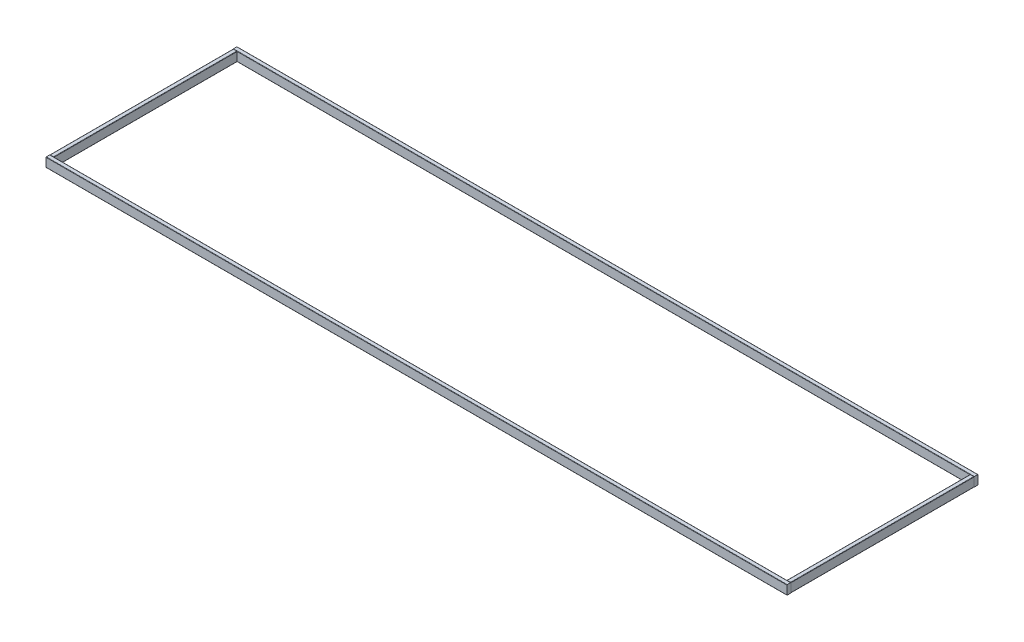
ISO-10303-21;
HEADER;
FILE_DESCRIPTION(('STEP AP214'),'2;1');
FILE_NAME('part.step','',(''),(''),'','','');
FILE_SCHEMA(('AUTOMOTIVE_DESIGN { 1 0 10303 214 1 1 1 1 }'));
ENDSEC;
DATA;
#1=APPLICATION_CONTEXT('core data for automotive mechanical design processes');
#2=APPLICATION_PROTOCOL_DEFINITION('international standard','automotive_design',2000,#1);
#3=PRODUCT_CONTEXT('',#1,'mechanical');
#4=PRODUCT('Part','Part','',(#3));
#5=PRODUCT_RELATED_PRODUCT_CATEGORY('part','',(#4));
#6=PRODUCT_DEFINITION_FORMATION('','',#4);
#7=PRODUCT_DEFINITION_CONTEXT('part definition',#1,'design');
#8=PRODUCT_DEFINITION('design','',#6,#7);
#9=PRODUCT_DEFINITION_SHAPE('','',#8);
#10=(LENGTH_UNIT() NAMED_UNIT(*) SI_UNIT(.MILLI.,.METRE.));
#11=(NAMED_UNIT(*) PLANE_ANGLE_UNIT() SI_UNIT($,.RADIAN.));
#12=(NAMED_UNIT(*) SI_UNIT($,.STERADIAN.) SOLID_ANGLE_UNIT());
#13=UNCERTAINTY_MEASURE_WITH_UNIT(LENGTH_MEASURE(1.E-05),#10,'distance_accuracy_value','');
#14=(GEOMETRIC_REPRESENTATION_CONTEXT(3) GLOBAL_UNCERTAINTY_ASSIGNED_CONTEXT((#13)) GLOBAL_UNIT_ASSIGNED_CONTEXT((#10,
#11,#12)) REPRESENTATION_CONTEXT('',''));
#15=CARTESIAN_POINT('',(0.,0.,0.));
#16=DIRECTION('',(0.,0.,1.));
#17=DIRECTION('',(1.,0.,0.));
#18=AXIS2_PLACEMENT_3D('',#15,#16,#17);
#19=CARTESIAN_POINT('',(-3556.,85.725,-892.175));
#20=DIRECTION('',(1.,0.,0.));
#21=DIRECTION('',(0.,0.,-1.));
#22=AXIS2_PLACEMENT_3D('',#19,#20,#21);
#23=CYLINDRICAL_SURFACE('',#22,3.175);
#24=CARTESIAN_POINT('',(3594.1,85.725,-892.175000000001));
#25=DIRECTION('',(1.,0.,0.));
#26=DIRECTION('',(0.,0.,-1.));
#27=AXIS2_PLACEMENT_3D('',#24,#25,#26);
#28=CIRCLE('',#27,3.175);
#29=CARTESIAN_POINT('',(3594.1,88.9,-892.175000000001));
#30=VERTEX_POINT('',#29);
#31=CARTESIAN_POINT('',(3594.1,85.725,-889.));
#32=VERTEX_POINT('',#31);
#33=EDGE_CURVE('E166',#30,#32,#28,.T.);
#34=ORIENTED_EDGE('',*,*,#33,.F.);
#35=DIRECTION('',(1.,0.,0.));
#36=VECTOR('',#35,1.);
#37=CARTESIAN_POINT('',(-3556.,88.9,-892.175));
#38=LINE('',#37,#36);
#39=CARTESIAN_POINT('',(-3594.1,88.9,-892.175));
#40=VERTEX_POINT('',#39);
#41=EDGE_CURVE('E208',#40,#30,#38,.T.);
#42=ORIENTED_EDGE('',*,*,#41,.F.);
#43=CARTESIAN_POINT('',(-3594.1,85.725,-892.175));
#44=DIRECTION('',(-1.,0.,0.));
#45=DIRECTION('',(0.,0.,1.));
#46=AXIS2_PLACEMENT_3D('',#43,#44,#45);
#47=CIRCLE('',#46,3.175);
#48=CARTESIAN_POINT('',(-3594.1,85.725,-889.));
#49=VERTEX_POINT('',#48);
#50=EDGE_CURVE('E154',#49,#40,#47,.T.);
#51=ORIENTED_EDGE('',*,*,#50,.F.);
#52=DIRECTION('',(1.,0.,0.));
#53=VECTOR('',#52,1.);
#54=CARTESIAN_POINT('',(-3556.,85.725,-889.));
#55=LINE('',#54,#53);
#56=EDGE_CURVE('E90',#49,#32,#55,.T.);
#57=ORIENTED_EDGE('',*,*,#56,.T.);
#58=EDGE_LOOP('',(#34,#42,#51,#57));
#59=FACE_BOUND('',#58,.T.);
#60=ADVANCED_FACE('F86',(#59),#23,.T.);
#61=CARTESIAN_POINT('',(-3556.,88.9,-892.175));
#62=DIRECTION('',(0.,-1.,0.));
#63=DIRECTION('',(0.,0.,-1.));
#64=AXIS2_PLACEMENT_3D('',#61,#62,#63);
#65=PLANE('',#64);
#66=DIRECTION('',(0.,0.,1.));
#67=VECTOR('',#66,1.);
#68=CARTESIAN_POINT('',(3594.1,88.9,-892.175));
#69=LINE('',#68,#67);
#70=CARTESIAN_POINT('',(3594.1,88.9,-923.925));
#71=VERTEX_POINT('',#70);
#72=EDGE_CURVE('E161',#71,#30,#69,.T.);
#73=ORIENTED_EDGE('',*,*,#72,.F.);
#74=DIRECTION('',(1.,0.,0.));
#75=VECTOR('',#74,1.);
#76=CARTESIAN_POINT('',(-3556.,88.9,-923.924999999999));
#77=LINE('',#76,#75);
#78=CARTESIAN_POINT('',(-3594.1,88.9,-923.924999999999));
#79=VERTEX_POINT('',#78);
#80=EDGE_CURVE('E205',#79,#71,#77,.T.);
#81=ORIENTED_EDGE('',*,*,#80,.F.);
#82=DIRECTION('',(0.,0.,-1.));
#83=VECTOR('',#82,1.);
#84=CARTESIAN_POINT('',(-3594.1,88.9,-892.175));
#85=LINE('',#84,#83);
#86=EDGE_CURVE('E235',#40,#79,#85,.T.);
#87=ORIENTED_EDGE('',*,*,#86,.F.);
#88=ORIENTED_EDGE('',*,*,#41,.T.);
#89=EDGE_LOOP('',(#73,#81,#87,#88));
#90=FACE_BOUND('',#89,.T.);
#91=ADVANCED_FACE('F224',(#90),#65,.F.);
#92=CARTESIAN_POINT('',(-3556.,85.725,-923.924999999999));
#93=DIRECTION('',(1.,0.,0.));
#94=DIRECTION('',(0.,0.,-1.));
#95=AXIS2_PLACEMENT_3D('',#92,#93,#94);
#96=CYLINDRICAL_SURFACE('',#95,3.175);
#97=CARTESIAN_POINT('',(3594.1,85.725,-923.925));
#98=DIRECTION('',(1.,0.,0.));
#99=DIRECTION('',(0.,0.,-1.));
#100=AXIS2_PLACEMENT_3D('',#97,#98,#99);
#101=CIRCLE('',#100,3.175);
#102=CARTESIAN_POINT('',(3594.1,85.725,-927.1));
#103=VERTEX_POINT('',#102);
#104=EDGE_CURVE('E13',#103,#71,#101,.T.);
#105=ORIENTED_EDGE('',*,*,#104,.F.);
#106=DIRECTION('',(1.,0.,0.));
#107=VECTOR('',#106,1.);
#108=CARTESIAN_POINT('',(-3556.,85.725,-927.1));
#109=LINE('',#108,#107);
#110=CARTESIAN_POINT('',(-3594.1,85.725,-927.1));
#111=VERTEX_POINT('',#110);
#112=EDGE_CURVE('E201',#111,#103,#109,.T.);
#113=ORIENTED_EDGE('',*,*,#112,.F.);
#114=CARTESIAN_POINT('',(-3594.1,85.725,-923.924999999999));
#115=DIRECTION('',(-1.,0.,0.));
#116=DIRECTION('',(0.,0.,1.));
#117=AXIS2_PLACEMENT_3D('',#114,#115,#116);
#118=CIRCLE('',#117,3.175);
#119=EDGE_CURVE('E231',#79,#111,#118,.T.);
#120=ORIENTED_EDGE('',*,*,#119,.F.);
#121=ORIENTED_EDGE('',*,*,#80,.T.);
#122=EDGE_LOOP('',(#105,#113,#120,#121));
#123=FACE_BOUND('',#122,.T.);
#124=ADVANCED_FACE('F228',(#123),#96,.T.);
#125=CARTESIAN_POINT('',(-3556.,3.175,-927.1));
#126=DIRECTION('',(0.,0.,1.));
#127=DIRECTION('',(1.,0.,0.));
#128=AXIS2_PLACEMENT_3D('',#125,#126,#127);
#129=PLANE('',#128);
#130=DIRECTION('',(0.,1.,0.));
#131=VECTOR('',#130,1.);
#132=CARTESIAN_POINT('',(3594.1,3.175,-927.1));
#133=LINE('',#132,#131);
#134=CARTESIAN_POINT('',(3594.1,3.175,-927.1));
#135=VERTEX_POINT('',#134);
#136=EDGE_CURVE('E96',#135,#103,#133,.T.);
#137=ORIENTED_EDGE('',*,*,#136,.F.);
#138=DIRECTION('',(1.,0.,0.));
#139=VECTOR('',#138,1.);
#140=CARTESIAN_POINT('',(-3556.,3.175,-927.1));
#141=LINE('',#140,#139);
#142=CARTESIAN_POINT('',(-3594.1,3.175,-927.1));
#143=VERTEX_POINT('',#142);
#144=EDGE_CURVE('E197',#143,#135,#141,.T.);
#145=ORIENTED_EDGE('',*,*,#144,.F.);
#146=DIRECTION('',(0.,-1.,0.));
#147=VECTOR('',#146,1.);
#148=CARTESIAN_POINT('',(-3594.1,3.175,-927.1));
#149=LINE('',#148,#147);
#150=EDGE_CURVE('E234',#111,#143,#149,.T.);
#151=ORIENTED_EDGE('',*,*,#150,.F.);
#152=ORIENTED_EDGE('',*,*,#112,.T.);
#153=EDGE_LOOP('',(#137,#145,#151,#152));
#154=FACE_BOUND('',#153,.T.);
#155=ADVANCED_FACE('F250',(#154),#129,.F.);
#156=CARTESIAN_POINT('',(-3556.,3.175,-923.924999999999));
#157=DIRECTION('',(1.,0.,0.));
#158=DIRECTION('',(0.,0.,-1.));
#159=AXIS2_PLACEMENT_3D('',#156,#157,#158);
#160=CYLINDRICAL_SURFACE('',#159,3.175);
#161=CARTESIAN_POINT('',(3594.1,3.175,-923.925));
#162=DIRECTION('',(1.,0.,0.));
#163=DIRECTION('',(0.,0.,-1.));
#164=AXIS2_PLACEMENT_3D('',#161,#162,#163);
#165=CIRCLE('',#164,3.175);
#166=CARTESIAN_POINT('',(3594.1,0.,-923.925));
#167=VERTEX_POINT('',#166);
#168=EDGE_CURVE('E179',#167,#135,#165,.T.);
#169=ORIENTED_EDGE('',*,*,#168,.F.);
#170=DIRECTION('',(1.,0.,0.));
#171=VECTOR('',#170,1.);
#172=CARTESIAN_POINT('',(-3556.,0.,-923.924999999999));
#173=LINE('',#172,#171);
#174=CARTESIAN_POINT('',(-3594.1,0.,-923.924999999999));
#175=VERTEX_POINT('',#174);
#176=EDGE_CURVE('E193',#175,#167,#173,.T.);
#177=ORIENTED_EDGE('',*,*,#176,.F.);
#178=CARTESIAN_POINT('',(-3594.1,3.175,-923.924999999999));
#179=DIRECTION('',(-1.,0.,0.));
#180=DIRECTION('',(0.,0.,1.));
#181=AXIS2_PLACEMENT_3D('',#178,#179,#180);
#182=CIRCLE('',#181,3.175);
#183=EDGE_CURVE('E168',#143,#175,#182,.T.);
#184=ORIENTED_EDGE('',*,*,#183,.F.);
#185=ORIENTED_EDGE('',*,*,#144,.T.);
#186=EDGE_LOOP('',(#169,#177,#184,#185));
#187=FACE_BOUND('',#186,.T.);
#188=ADVANCED_FACE('F247',(#187),#160,.T.);
#189=CARTESIAN_POINT('',(-3556.,0.,-923.924999999999));
#190=DIRECTION('',(0.,1.,0.));
#191=DIRECTION('',(0.,0.,1.));
#192=AXIS2_PLACEMENT_3D('',#189,#190,#191);
#193=PLANE('',#192);
#194=DIRECTION('',(0.,0.,-1.));
#195=VECTOR('',#194,1.);
#196=CARTESIAN_POINT('',(3594.1,0.,-923.924999999999));
#197=LINE('',#196,#195);
#198=CARTESIAN_POINT('',(3594.1,0.,-892.175000000001));
#199=VERTEX_POINT('',#198);
#200=EDGE_CURVE('E183',#199,#167,#197,.T.);
#201=ORIENTED_EDGE('',*,*,#200,.F.);
#202=DIRECTION('',(1.,0.,0.));
#203=VECTOR('',#202,1.);
#204=CARTESIAN_POINT('',(-3556.,0.,-892.175));
#205=LINE('',#204,#203);
#206=CARTESIAN_POINT('',(-3594.1,0.,-892.175));
#207=VERTEX_POINT('',#206);
#208=EDGE_CURVE('E147',#207,#199,#205,.T.);
#209=ORIENTED_EDGE('',*,*,#208,.F.);
#210=DIRECTION('',(0.,0.,1.));
#211=VECTOR('',#210,1.);
#212=CARTESIAN_POINT('',(-3594.1,0.,-923.924999999999));
#213=LINE('',#212,#211);
#214=EDGE_CURVE('E159',#175,#207,#213,.T.);
#215=ORIENTED_EDGE('',*,*,#214,.F.);
#216=ORIENTED_EDGE('',*,*,#176,.T.);
#217=EDGE_LOOP('',(#201,#209,#215,#216));
#218=FACE_BOUND('',#217,.T.);
#219=ADVANCED_FACE('F255',(#218),#193,.F.);
#220=CARTESIAN_POINT('',(-3556.,3.175,-892.175));
#221=DIRECTION('',(1.,0.,0.));
#222=DIRECTION('',(0.,0.,-1.));
#223=AXIS2_PLACEMENT_3D('',#220,#221,#222);
#224=CYLINDRICAL_SURFACE('',#223,3.175);
#225=CARTESIAN_POINT('',(3594.1,3.175,-892.175000000001));
#226=DIRECTION('',(1.,0.,0.));
#227=DIRECTION('',(0.,0.,-1.));
#228=AXIS2_PLACEMENT_3D('',#225,#226,#227);
#229=CIRCLE('',#228,3.175);
#230=CARTESIAN_POINT('',(3594.1,3.175,-889.));
#231=VERTEX_POINT('',#230);
#232=EDGE_CURVE('E143',#231,#199,#229,.T.);
#233=ORIENTED_EDGE('',*,*,#232,.F.);
#234=DIRECTION('',(1.,0.,0.));
#235=VECTOR('',#234,1.);
#236=CARTESIAN_POINT('',(-3556.,3.175,-889.));
#237=LINE('',#236,#235);
#238=CARTESIAN_POINT('',(-3594.1,3.175,-889.));
#239=VERTEX_POINT('',#238);
#240=EDGE_CURVE('E104',#239,#231,#237,.T.);
#241=ORIENTED_EDGE('',*,*,#240,.F.);
#242=CARTESIAN_POINT('',(-3594.1,3.175,-892.175));
#243=DIRECTION('',(-1.,0.,0.));
#244=DIRECTION('',(0.,0.,1.));
#245=AXIS2_PLACEMENT_3D('',#242,#243,#244);
#246=CIRCLE('',#245,3.175);
#247=EDGE_CURVE('E140',#207,#239,#246,.T.);
#248=ORIENTED_EDGE('',*,*,#247,.F.);
#249=ORIENTED_EDGE('',*,*,#208,.T.);
#250=EDGE_LOOP('',(#233,#241,#248,#249));
#251=FACE_BOUND('',#250,.T.);
#252=ADVANCED_FACE('F137',(#251),#224,.T.);
#253=CARTESIAN_POINT('',(-3556.,85.725,-889.));
#254=DIRECTION('',(0.,0.,-1.));
#255=DIRECTION('',(-1.,0.,0.));
#256=AXIS2_PLACEMENT_3D('',#253,#254,#255);
#257=PLANE('',#256);
#258=DIRECTION('',(0.,-1.,0.));
#259=VECTOR('',#258,1.);
#260=CARTESIAN_POINT('',(3594.1,85.725,-889.));
#261=LINE('',#260,#259);
#262=EDGE_CURVE('E174',#32,#231,#261,.T.);
#263=ORIENTED_EDGE('',*,*,#262,.F.);
#264=ORIENTED_EDGE('',*,*,#56,.F.);
#265=DIRECTION('',(0.,1.,0.));
#266=VECTOR('',#265,1.);
#267=CARTESIAN_POINT('',(-3594.1,85.725,-889.));
#268=LINE('',#267,#266);
#269=EDGE_CURVE('E146',#239,#49,#268,.T.);
#270=ORIENTED_EDGE('',*,*,#269,.F.);
#271=ORIENTED_EDGE('',*,*,#240,.T.);
#272=EDGE_LOOP('',(#263,#264,#270,#271));
#273=FACE_BOUND('',#272,.T.);
#274=ADVANCED_FACE('F150',(#273),#257,.F.);
#275=CARTESIAN_POINT('',(-3594.1,88.9,-888.999999999999));
#276=DIRECTION('',(-1.,0.,0.));
#277=DIRECTION('',(0.,0.,1.));
#278=AXIS2_PLACEMENT_3D('',#275,#276,#277);
#279=PLANE('',#278);
#280=ORIENTED_EDGE('',*,*,#269,.T.);
#281=ORIENTED_EDGE('',*,*,#50,.T.);
#282=ORIENTED_EDGE('',*,*,#86,.T.);
#283=ORIENTED_EDGE('',*,*,#119,.T.);
#284=ORIENTED_EDGE('',*,*,#150,.T.);
#285=ORIENTED_EDGE('',*,*,#183,.T.);
#286=ORIENTED_EDGE('',*,*,#214,.T.);
#287=ORIENTED_EDGE('',*,*,#247,.T.);
#288=EDGE_LOOP('',(#280,#281,#282,#283,#284,#285,#286,#287));
#289=FACE_BOUND('',#288,.T.);
#290=ADVANCED_FACE('F157',(#289),#279,.T.);
#291=CARTESIAN_POINT('',(3594.1,0.,-889.));
#292=DIRECTION('',(1.,0.,0.));
#293=DIRECTION('',(0.,0.,-1.));
#294=AXIS2_PLACEMENT_3D('',#291,#292,#293);
#295=PLANE('',#294);
#296=ORIENTED_EDGE('',*,*,#72,.T.);
#297=ORIENTED_EDGE('',*,*,#33,.T.);
#298=ORIENTED_EDGE('',*,*,#262,.T.);
#299=ORIENTED_EDGE('',*,*,#232,.T.);
#300=ORIENTED_EDGE('',*,*,#200,.T.);
#301=ORIENTED_EDGE('',*,*,#168,.T.);
#302=ORIENTED_EDGE('',*,*,#136,.T.);
#303=ORIENTED_EDGE('',*,*,#104,.T.);
#304=EDGE_LOOP('',(#296,#297,#298,#299,#300,#301,#302,#303));
#305=FACE_BOUND('',#304,.T.);
#306=ADVANCED_FACE('F88',(#305),#295,.T.);
#307=CLOSED_SHELL('',(#60,#91,#124,#155,#188,#219,#252,#274,#290,#306));
#308=MANIFOLD_SOLID_BREP('B2',#307);
#309=CARTESIAN_POINT('',(3556.,85.725,-889.));
#310=DIRECTION('',(1.,0.,0.));
#311=DIRECTION('',(0.,0.,-1.));
#312=AXIS2_PLACEMENT_3D('',#309,#310,#311);
#313=PLANE('',#312);
#314=DIRECTION('',(0.,1.,0.));
#315=VECTOR('',#314,1.);
#316=CARTESIAN_POINT('',(3556.,85.725,-889.));
#317=LINE('',#316,#315);
#318=CARTESIAN_POINT('',(3556.,3.175,-889.));
#319=VERTEX_POINT('',#318);
#320=CARTESIAN_POINT('',(3556.,85.725,-889.));
#321=VERTEX_POINT('',#320);
#322=EDGE_CURVE('E436',#319,#321,#317,.T.);
#323=ORIENTED_EDGE('',*,*,#322,.F.);
#324=DIRECTION('',(0.,0.,1.));
#325=VECTOR('',#324,1.);
#326=CARTESIAN_POINT('',(3556.,3.175,-889.));
#327=LINE('',#326,#325);
#328=CARTESIAN_POINT('',(3556.,3.175,889.));
#329=VERTEX_POINT('',#328);
#330=EDGE_CURVE('E516',#319,#329,#327,.T.);
#331=ORIENTED_EDGE('',*,*,#330,.T.);
#332=DIRECTION('',(0.,-1.,0.));
#333=VECTOR('',#332,1.);
#334=CARTESIAN_POINT('',(3556.,85.725,889.));
#335=LINE('',#334,#333);
#336=CARTESIAN_POINT('',(3556.,85.725,889.));
#337=VERTEX_POINT('',#336);
#338=EDGE_CURVE('E483',#337,#329,#335,.T.);
#339=ORIENTED_EDGE('',*,*,#338,.F.);
#340=DIRECTION('',(0.,0.,1.));
#341=VECTOR('',#340,1.);
#342=CARTESIAN_POINT('',(3556.,85.725,-889.));
#343=LINE('',#342,#341);
#344=EDGE_CURVE('E396',#321,#337,#343,.T.);
#345=ORIENTED_EDGE('',*,*,#344,.F.);
#346=EDGE_LOOP('',(#323,#331,#339,#345));
#347=FACE_BOUND('',#346,.T.);
#348=ADVANCED_FACE('F393',(#347),#313,.F.);
#349=CARTESIAN_POINT('',(3559.175,3.175,-889.));
#350=DIRECTION('',(0.,0.,1.));
#351=DIRECTION('',(1.,0.,0.));
#352=AXIS2_PLACEMENT_3D('',#349,#350,#351);
#353=CYLINDRICAL_SURFACE('',#352,3.175);
#354=CARTESIAN_POINT('',(3559.175,3.175,-889.));
#355=DIRECTION('',(0.,0.,-1.));
#356=DIRECTION('',(-1.,0.,0.));
#357=AXIS2_PLACEMENT_3D('',#354,#355,#356);
#358=CIRCLE('',#357,3.175);
#359=CARTESIAN_POINT('',(3559.175,0.,-889.));
#360=VERTEX_POINT('',#359);
#361=EDGE_CURVE('E498',#360,#319,#358,.T.);
#362=ORIENTED_EDGE('',*,*,#361,.F.);
#363=DIRECTION('',(0.,0.,1.));
#364=VECTOR('',#363,1.);
#365=CARTESIAN_POINT('',(3559.175,0.,-889.));
#366=LINE('',#365,#364);
#367=CARTESIAN_POINT('',(3559.175,0.,889.));
#368=VERTEX_POINT('',#367);
#369=EDGE_CURVE('E508',#360,#368,#366,.T.);
#370=ORIENTED_EDGE('',*,*,#369,.T.);
#371=CARTESIAN_POINT('',(3559.175,3.175,889.));
#372=DIRECTION('',(0.,0.,1.));
#373=DIRECTION('',(1.,0.,0.));
#374=AXIS2_PLACEMENT_3D('',#371,#372,#373);
#375=CIRCLE('',#374,3.175);
#376=EDGE_CURVE('E485',#329,#368,#375,.T.);
#377=ORIENTED_EDGE('',*,*,#376,.F.);
#378=ORIENTED_EDGE('',*,*,#330,.F.);
#379=EDGE_LOOP('',(#362,#370,#377,#378));
#380=FACE_BOUND('',#379,.T.);
#381=ADVANCED_FACE('F523',(#380),#353,.T.);
#382=CARTESIAN_POINT('',(3590.925,0.,-889.));
#383=DIRECTION('',(0.,1.,0.));
#384=DIRECTION('',(0.,0.,1.));
#385=AXIS2_PLACEMENT_3D('',#382,#383,#384);
#386=PLANE('',#385);
#387=DIRECTION('',(1.,0.,0.));
#388=VECTOR('',#387,1.);
#389=CARTESIAN_POINT('',(-3556.,0.,-889.));
#390=LINE('',#389,#388);
#391=CARTESIAN_POINT('',(3590.925,0.,-889.));
#392=VERTEX_POINT('',#391);
#393=EDGE_CURVE('E504',#360,#392,#390,.T.);
#394=ORIENTED_EDGE('',*,*,#393,.T.);
#395=DIRECTION('',(0.,0.,1.));
#396=VECTOR('',#395,1.);
#397=CARTESIAN_POINT('',(3590.925,0.,-889.));
#398=LINE('',#397,#396);
#399=CARTESIAN_POINT('',(3590.925,0.,889.));
#400=VERTEX_POINT('',#399);
#401=EDGE_CURVE('E507',#392,#400,#398,.T.);
#402=ORIENTED_EDGE('',*,*,#401,.T.);
#403=DIRECTION('',(1.,0.,0.));
#404=VECTOR('',#403,1.);
#405=CARTESIAN_POINT('',(-3556.,0.,889.));
#406=LINE('',#405,#404);
#407=EDGE_CURVE('E493',#368,#400,#406,.T.);
#408=ORIENTED_EDGE('',*,*,#407,.F.);
#409=ORIENTED_EDGE('',*,*,#369,.F.);
#410=EDGE_LOOP('',(#394,#402,#408,#409));
#411=FACE_BOUND('',#410,.T.);
#412=ADVANCED_FACE('F526',(#411),#386,.F.);
#413=CARTESIAN_POINT('',(3590.925,3.175,-889.));
#414=DIRECTION('',(0.,0.,1.));
#415=DIRECTION('',(1.,0.,0.));
#416=AXIS2_PLACEMENT_3D('',#413,#414,#415);
#417=CYLINDRICAL_SURFACE('',#416,3.175);
#418=CARTESIAN_POINT('',(3590.925,3.175,-889.));
#419=DIRECTION('',(0.,0.,-1.));
#420=DIRECTION('',(-1.,0.,0.));
#421=AXIS2_PLACEMENT_3D('',#418,#419,#420);
#422=CIRCLE('',#421,3.175);
#423=CARTESIAN_POINT('',(3594.1,3.175,-889.));
#424=VERTEX_POINT('',#423);
#425=EDGE_CURVE('E497',#424,#392,#422,.T.);
#426=ORIENTED_EDGE('',*,*,#425,.F.);
#427=DIRECTION('',(0.,0.,1.));
#428=VECTOR('',#427,1.);
#429=CARTESIAN_POINT('',(3594.1,3.175,-889.));
#430=LINE('',#429,#428);
#431=CARTESIAN_POINT('',(3594.1,3.175,889.));
#432=VERTEX_POINT('',#431);
#433=EDGE_CURVE('E513',#424,#432,#430,.T.);
#434=ORIENTED_EDGE('',*,*,#433,.T.);
#435=CARTESIAN_POINT('',(3590.925,3.175,889.));
#436=DIRECTION('',(0.,0.,1.));
#437=DIRECTION('',(1.,0.,0.));
#438=AXIS2_PLACEMENT_3D('',#435,#436,#437);
#439=CIRCLE('',#438,3.175);
#440=EDGE_CURVE('E490',#400,#432,#439,.T.);
#441=ORIENTED_EDGE('',*,*,#440,.F.);
#442=ORIENTED_EDGE('',*,*,#401,.F.);
#443=EDGE_LOOP('',(#426,#434,#441,#442));
#444=FACE_BOUND('',#443,.T.);
#445=ADVANCED_FACE('F532',(#444),#417,.T.);
#446=CARTESIAN_POINT('',(3594.1,3.175,-889.));
#447=DIRECTION('',(-1.,0.,0.));
#448=DIRECTION('',(0.,0.,1.));
#449=AXIS2_PLACEMENT_3D('',#446,#447,#448);
#450=PLANE('',#449);
#451=DIRECTION('',(0.,-1.,0.));
#452=VECTOR('',#451,1.);
#453=CARTESIAN_POINT('',(3594.1,3.175,-889.));
#454=LINE('',#453,#452);
#455=CARTESIAN_POINT('',(3594.1,85.725,-889.));
#456=VERTEX_POINT('',#455);
#457=EDGE_CURVE('E84',#456,#424,#454,.T.);
#458=ORIENTED_EDGE('',*,*,#457,.F.);
#459=DIRECTION('',(0.,0.,1.));
#460=VECTOR('',#459,1.);
#461=CARTESIAN_POINT('',(3594.1,85.725,-889.));
#462=LINE('',#461,#460);
#463=CARTESIAN_POINT('',(3594.1,85.725,889.));
#464=VERTEX_POINT('',#463);
#465=EDGE_CURVE('E511',#456,#464,#462,.T.);
#466=ORIENTED_EDGE('',*,*,#465,.T.);
#467=DIRECTION('',(0.,1.,0.));
#468=VECTOR('',#467,1.);
#469=CARTESIAN_POINT('',(3594.1,3.175,889.));
#470=LINE('',#469,#468);
#471=EDGE_CURVE('E499',#432,#464,#470,.T.);
#472=ORIENTED_EDGE('',*,*,#471,.F.);
#473=ORIENTED_EDGE('',*,*,#433,.F.);
#474=EDGE_LOOP('',(#458,#466,#472,#473));
#475=FACE_BOUND('',#474,.T.);
#476=ADVANCED_FACE('F538',(#475),#450,.F.);
#477=CARTESIAN_POINT('',(3590.925,85.725,-889.));
#478=DIRECTION('',(0.,0.,1.));
#479=DIRECTION('',(1.,0.,0.));
#480=AXIS2_PLACEMENT_3D('',#477,#478,#479);
#481=CYLINDRICAL_SURFACE('',#480,3.175);
#482=CARTESIAN_POINT('',(3590.925,85.725,-889.));
#483=DIRECTION('',(0.,0.,-1.));
#484=DIRECTION('',(-1.,0.,0.));
#485=AXIS2_PLACEMENT_3D('',#482,#483,#484);
#486=CIRCLE('',#485,3.175);
#487=CARTESIAN_POINT('',(3590.925,88.9,-889.));
#488=VERTEX_POINT('',#487);
#489=EDGE_CURVE('E402',#488,#456,#486,.T.);
#490=ORIENTED_EDGE('',*,*,#489,.F.);
#491=DIRECTION('',(0.,0.,1.));
#492=VECTOR('',#491,1.);
#493=CARTESIAN_POINT('',(3590.925,88.9,-889.));
#494=LINE('',#493,#492);
#495=CARTESIAN_POINT('',(3590.925,88.9,889.));
#496=VERTEX_POINT('',#495);
#497=EDGE_CURVE('E459',#488,#496,#494,.T.);
#498=ORIENTED_EDGE('',*,*,#497,.T.);
#499=CARTESIAN_POINT('',(3590.925,85.725,889.));
#500=DIRECTION('',(0.,0.,1.));
#501=DIRECTION('',(1.,0.,0.));
#502=AXIS2_PLACEMENT_3D('',#499,#500,#501);
#503=CIRCLE('',#502,3.175);
#504=EDGE_CURVE('E479',#464,#496,#503,.T.);
#505=ORIENTED_EDGE('',*,*,#504,.F.);
#506=ORIENTED_EDGE('',*,*,#465,.F.);
#507=EDGE_LOOP('',(#490,#498,#505,#506));
#508=FACE_BOUND('',#507,.T.);
#509=ADVANCED_FACE('F537',(#508),#481,.T.);
#510=CARTESIAN_POINT('',(3559.175,88.9,-889.));
#511=DIRECTION('',(0.,-1.,0.));
#512=DIRECTION('',(0.,0.,-1.));
#513=AXIS2_PLACEMENT_3D('',#510,#511,#512);
#514=PLANE('',#513);
#515=DIRECTION('',(1.,0.,0.));
#516=VECTOR('',#515,1.);
#517=CARTESIAN_POINT('',(-3556.,88.9,-889.));
#518=LINE('',#517,#516);
#519=CARTESIAN_POINT('',(3559.175,88.9,-889.));
#520=VERTEX_POINT('',#519);
#521=EDGE_CURVE('E429',#520,#488,#518,.T.);
#522=ORIENTED_EDGE('',*,*,#521,.F.);
#523=DIRECTION('',(0.,0.,1.));
#524=VECTOR('',#523,1.);
#525=CARTESIAN_POINT('',(3559.175,88.9,-889.));
#526=LINE('',#525,#524);
#527=CARTESIAN_POINT('',(3559.175,88.9,889.));
#528=VERTEX_POINT('',#527);
#529=EDGE_CURVE('E465',#520,#528,#526,.T.);
#530=ORIENTED_EDGE('',*,*,#529,.T.);
#531=DIRECTION('',(1.,0.,0.));
#532=VECTOR('',#531,1.);
#533=CARTESIAN_POINT('',(-3556.,88.9,889.));
#534=LINE('',#533,#532);
#535=EDGE_CURVE('E468',#528,#496,#534,.T.);
#536=ORIENTED_EDGE('',*,*,#535,.T.);
#537=ORIENTED_EDGE('',*,*,#497,.F.);
#538=EDGE_LOOP('',(#522,#530,#536,#537));
#539=FACE_BOUND('',#538,.T.);
#540=ADVANCED_FACE('F467',(#539),#514,.F.);
#541=CARTESIAN_POINT('',(3559.175,85.725,-889.));
#542=DIRECTION('',(0.,0.,1.));
#543=DIRECTION('',(1.,0.,0.));
#544=AXIS2_PLACEMENT_3D('',#541,#542,#543);
#545=CYLINDRICAL_SURFACE('',#544,3.175);
#546=CARTESIAN_POINT('',(3559.175,85.725,-889.));
#547=DIRECTION('',(0.,0.,-1.));
#548=DIRECTION('',(-1.,0.,0.));
#549=AXIS2_PLACEMENT_3D('',#546,#547,#548);
#550=CIRCLE('',#549,3.175);
#551=EDGE_CURVE('E433',#321,#520,#550,.T.);
#552=ORIENTED_EDGE('',*,*,#551,.F.);
#553=ORIENTED_EDGE('',*,*,#344,.T.);
#554=CARTESIAN_POINT('',(3559.175,85.725,889.));
#555=DIRECTION('',(0.,0.,1.));
#556=DIRECTION('',(1.,0.,0.));
#557=AXIS2_PLACEMENT_3D('',#554,#555,#556);
#558=CIRCLE('',#557,3.175);
#559=EDGE_CURVE('E476',#528,#337,#558,.T.);
#560=ORIENTED_EDGE('',*,*,#559,.F.);
#561=ORIENTED_EDGE('',*,*,#529,.F.);
#562=EDGE_LOOP('',(#552,#553,#560,#561));
#563=FACE_BOUND('',#562,.T.);
#564=ADVANCED_FACE('F481',(#563),#545,.T.);
#565=CARTESIAN_POINT('',(-3556.,3.175,889.));
#566=DIRECTION('',(0.,0.,1.));
#567=DIRECTION('',(1.,0.,0.));
#568=AXIS2_PLACEMENT_3D('',#565,#566,#567);
#569=PLANE('',#568);
#570=ORIENTED_EDGE('',*,*,#504,.T.);
#571=ORIENTED_EDGE('',*,*,#535,.F.);
#572=ORIENTED_EDGE('',*,*,#559,.T.);
#573=ORIENTED_EDGE('',*,*,#338,.T.);
#574=ORIENTED_EDGE('',*,*,#376,.T.);
#575=ORIENTED_EDGE('',*,*,#407,.T.);
#576=ORIENTED_EDGE('',*,*,#440,.T.);
#577=ORIENTED_EDGE('',*,*,#471,.T.);
#578=EDGE_LOOP('',(#570,#571,#572,#573,#574,#575,#576,#577));
#579=FACE_BOUND('',#578,.T.);
#580=ADVANCED_FACE('F474',(#579),#569,.T.);
#581=CARTESIAN_POINT('',(-3556.,85.725,-889.));
#582=DIRECTION('',(0.,0.,-1.));
#583=DIRECTION('',(-1.,0.,0.));
#584=AXIS2_PLACEMENT_3D('',#581,#582,#583);
#585=PLANE('',#584);
#586=ORIENTED_EDGE('',*,*,#425,.T.);
#587=ORIENTED_EDGE('',*,*,#393,.F.);
#588=ORIENTED_EDGE('',*,*,#361,.T.);
#589=ORIENTED_EDGE('',*,*,#322,.T.);
#590=ORIENTED_EDGE('',*,*,#551,.T.);
#591=ORIENTED_EDGE('',*,*,#521,.T.);
#592=ORIENTED_EDGE('',*,*,#489,.T.);
#593=ORIENTED_EDGE('',*,*,#457,.T.);
#594=EDGE_LOOP('',(#586,#587,#588,#589,#590,#591,#592,#593));
#595=FACE_BOUND('',#594,.T.);
#596=ADVANCED_FACE('F603',(#595),#585,.T.);
#597=CLOSED_SHELL('',(#348,#381,#412,#445,#476,#509,#540,#564,#580,#596));
#598=MANIFOLD_SOLID_BREP('B7',#597);
#599=CARTESIAN_POINT('',(-3594.1,85.725,-888.999999999999));
#600=DIRECTION('',(1.,0.,0.));
#601=DIRECTION('',(0.,0.,-1.));
#602=AXIS2_PLACEMENT_3D('',#599,#600,#601);
#603=PLANE('',#602);
#604=DIRECTION('',(0.,1.,0.));
#605=VECTOR('',#604,1.);
#606=CARTESIAN_POINT('',(-3594.1,85.725,-889.));
#607=LINE('',#606,#605);
#608=CARTESIAN_POINT('',(-3594.1,3.175,-889.));
#609=VERTEX_POINT('',#608);
#610=CARTESIAN_POINT('',(-3594.1,85.725,-889.));
#611=VERTEX_POINT('',#610);
#612=EDGE_CURVE('E718',#609,#611,#607,.T.);
#613=ORIENTED_EDGE('',*,*,#612,.F.);
#614=DIRECTION('',(0.,0.,1.));
#615=VECTOR('',#614,1.);
#616=CARTESIAN_POINT('',(-3594.1,3.175,-888.999999999999));
#617=LINE('',#616,#615);
#618=CARTESIAN_POINT('',(-3594.1,3.175,889.));
#619=VERTEX_POINT('',#618);
#620=EDGE_CURVE('E756',#609,#619,#617,.T.);
#621=ORIENTED_EDGE('',*,*,#620,.T.);
#622=DIRECTION('',(0.,-1.,0.));
#623=VECTOR('',#622,1.);
#624=CARTESIAN_POINT('',(-3594.1,85.725,889.));
#625=LINE('',#624,#623);
#626=CARTESIAN_POINT('',(-3594.1,85.725,889.));
#627=VERTEX_POINT('',#626);
#628=EDGE_CURVE('E767',#627,#619,#625,.T.);
#629=ORIENTED_EDGE('',*,*,#628,.F.);
#630=DIRECTION('',(0.,0.,1.));
#631=VECTOR('',#630,1.);
#632=CARTESIAN_POINT('',(-3594.1,85.725,-888.999999999999));
#633=LINE('',#632,#631);
#634=EDGE_CURVE('E678',#611,#627,#633,.T.);
#635=ORIENTED_EDGE('',*,*,#634,.F.);
#636=EDGE_LOOP('',(#613,#621,#629,#635));
#637=FACE_BOUND('',#636,.T.);
#638=ADVANCED_FACE('F675',(#637),#603,.F.);
#639=CARTESIAN_POINT('',(-3590.925,3.175,-888.999999999999));
#640=DIRECTION('',(0.,0.,1.));
#641=DIRECTION('',(1.,0.,0.));
#642=AXIS2_PLACEMENT_3D('',#639,#640,#641);
#643=CYLINDRICAL_SURFACE('',#642,3.175);
#644=CARTESIAN_POINT('',(-3590.925,3.175,-889.));
#645=DIRECTION('',(0.,0.,-1.));
#646=DIRECTION('',(-1.,0.,0.));
#647=AXIS2_PLACEMENT_3D('',#644,#645,#646);
#648=CIRCLE('',#647,3.175);
#649=CARTESIAN_POINT('',(-3590.925,0.,-889.));
#650=VERTEX_POINT('',#649);
#651=EDGE_CURVE('E754',#650,#609,#648,.T.);
#652=ORIENTED_EDGE('',*,*,#651,.F.);
#653=DIRECTION('',(0.,0.,1.));
#654=VECTOR('',#653,1.);
#655=CARTESIAN_POINT('',(-3590.925,0.,-888.999999999999));
#656=LINE('',#655,#654);
#657=CARTESIAN_POINT('',(-3590.925,0.,889.));
#658=VERTEX_POINT('',#657);
#659=EDGE_CURVE('E749',#650,#658,#656,.T.);
#660=ORIENTED_EDGE('',*,*,#659,.T.);
#661=CARTESIAN_POINT('',(-3590.925,3.175,889.));
#662=DIRECTION('',(0.,0.,1.));
#663=DIRECTION('',(1.,0.,0.));
#664=AXIS2_PLACEMENT_3D('',#661,#662,#663);
#665=CIRCLE('',#664,3.175);
#666=EDGE_CURVE('E753',#619,#658,#665,.T.);
#667=ORIENTED_EDGE('',*,*,#666,.F.);
#668=ORIENTED_EDGE('',*,*,#620,.F.);
#669=EDGE_LOOP('',(#652,#660,#667,#668));
#670=FACE_BOUND('',#669,.T.);
#671=ADVANCED_FACE('F751',(#670),#643,.T.);
#672=CARTESIAN_POINT('',(-3559.175,0.,-888.999999999999));
#673=DIRECTION('',(0.,1.,0.));
#674=DIRECTION('',(0.,0.,1.));
#675=AXIS2_PLACEMENT_3D('',#672,#673,#674);
#676=PLANE('',#675);
#677=DIRECTION('',(1.,0.,0.));
#678=VECTOR('',#677,1.);
#679=CARTESIAN_POINT('',(-3556.,0.,-889.));
#680=LINE('',#679,#678);
#681=CARTESIAN_POINT('',(-3559.175,0.,-889.));
#682=VERTEX_POINT('',#681);
#683=EDGE_CURVE('E755',#650,#682,#680,.T.);
#684=ORIENTED_EDGE('',*,*,#683,.T.);
#685=DIRECTION('',(0.,0.,1.));
#686=VECTOR('',#685,1.);
#687=CARTESIAN_POINT('',(-3559.175,0.,-888.999999999999));
#688=LINE('',#687,#686);
#689=CARTESIAN_POINT('',(-3559.175,0.,889.));
#690=VERTEX_POINT('',#689);
#691=EDGE_CURVE('E742',#682,#690,#688,.T.);
#692=ORIENTED_EDGE('',*,*,#691,.T.);
#693=DIRECTION('',(1.,0.,0.));
#694=VECTOR('',#693,1.);
#695=CARTESIAN_POINT('',(-3556.,0.,889.));
#696=LINE('',#695,#694);
#697=EDGE_CURVE('E763',#658,#690,#696,.T.);
#698=ORIENTED_EDGE('',*,*,#697,.F.);
#699=ORIENTED_EDGE('',*,*,#659,.F.);
#700=EDGE_LOOP('',(#684,#692,#698,#699));
#701=FACE_BOUND('',#700,.T.);
#702=ADVANCED_FACE('F769',(#701),#676,.F.);
#703=CARTESIAN_POINT('',(-3559.175,3.175,-888.999999999999));
#704=DIRECTION('',(0.,0.,1.));
#705=DIRECTION('',(1.,0.,0.));
#706=AXIS2_PLACEMENT_3D('',#703,#704,#705);
#707=CYLINDRICAL_SURFACE('',#706,3.175);
#708=CARTESIAN_POINT('',(-3559.175,3.175,-889.));
#709=DIRECTION('',(0.,0.,-1.));
#710=DIRECTION('',(-1.,0.,0.));
#711=AXIS2_PLACEMENT_3D('',#708,#709,#710);
#712=CIRCLE('',#711,3.175);
#713=CARTESIAN_POINT('',(-3556.,3.175,-889.));
#714=VERTEX_POINT('',#713);
#715=EDGE_CURVE('E777',#714,#682,#712,.T.);
#716=ORIENTED_EDGE('',*,*,#715,.F.);
#717=DIRECTION('',(0.,0.,1.));
#718=VECTOR('',#717,1.);
#719=CARTESIAN_POINT('',(-3556.,3.175,-888.999999999999));
#720=LINE('',#719,#718);
#721=CARTESIAN_POINT('',(-3556.,3.175,889.));
#722=VERTEX_POINT('',#721);
#723=EDGE_CURVE('E790',#714,#722,#720,.T.);
#724=ORIENTED_EDGE('',*,*,#723,.T.);
#725=CARTESIAN_POINT('',(-3559.175,3.175,889.));
#726=DIRECTION('',(0.,0.,1.));
#727=DIRECTION('',(1.,0.,0.));
#728=AXIS2_PLACEMENT_3D('',#725,#726,#727);
#729=CIRCLE('',#728,3.175);
#730=EDGE_CURVE('E770',#690,#722,#729,.T.);
#731=ORIENTED_EDGE('',*,*,#730,.F.);
#732=ORIENTED_EDGE('',*,*,#691,.F.);
#733=EDGE_LOOP('',(#716,#724,#731,#732));
#734=FACE_BOUND('',#733,.T.);
#735=ADVANCED_FACE('F821',(#734),#707,.T.);
#736=CARTESIAN_POINT('',(-3556.,3.175,-888.999999999999));
#737=DIRECTION('',(-1.,0.,0.));
#738=DIRECTION('',(0.,0.,1.));
#739=AXIS2_PLACEMENT_3D('',#736,#737,#738);
#740=PLANE('',#739);
#741=DIRECTION('',(0.,-1.,0.));
#742=VECTOR('',#741,1.);
#743=CARTESIAN_POINT('',(-3556.,3.175,-889.));
#744=LINE('',#743,#742);
#745=CARTESIAN_POINT('',(-3556.,85.725,-889.));
#746=VERTEX_POINT('',#745);
#747=EDGE_CURVE('E391',#746,#714,#744,.T.);
#748=ORIENTED_EDGE('',*,*,#747,.F.);
#749=DIRECTION('',(0.,0.,1.));
#750=VECTOR('',#749,1.);
#751=CARTESIAN_POINT('',(-3556.,85.725,-888.999999999999));
#752=LINE('',#751,#750);
#753=CARTESIAN_POINT('',(-3556.,85.725,889.));
#754=VERTEX_POINT('',#753);
#755=EDGE_CURVE('E788',#746,#754,#752,.T.);
#756=ORIENTED_EDGE('',*,*,#755,.T.);
#757=DIRECTION('',(0.,1.,0.));
#758=VECTOR('',#757,1.);
#759=CARTESIAN_POINT('',(-3556.,3.175,889.));
#760=LINE('',#759,#758);
#761=EDGE_CURVE('E772',#722,#754,#760,.T.);
#762=ORIENTED_EDGE('',*,*,#761,.F.);
#763=ORIENTED_EDGE('',*,*,#723,.F.);
#764=EDGE_LOOP('',(#748,#756,#762,#763));
#765=FACE_BOUND('',#764,.T.);
#766=ADVANCED_FACE('F819',(#765),#740,.F.);
#767=CARTESIAN_POINT('',(-3559.175,85.725,-888.999999999999));
#768=DIRECTION('',(0.,0.,1.));
#769=DIRECTION('',(1.,0.,0.));
#770=AXIS2_PLACEMENT_3D('',#767,#768,#769);
#771=CYLINDRICAL_SURFACE('',#770,3.175);
#772=CARTESIAN_POINT('',(-3559.175,85.725,-889.));
#773=DIRECTION('',(0.,0.,-1.));
#774=DIRECTION('',(-1.,0.,0.));
#775=AXIS2_PLACEMENT_3D('',#772,#773,#774);
#776=CIRCLE('',#775,3.175);
#777=CARTESIAN_POINT('',(-3559.175,88.9,-889.));
#778=VERTEX_POINT('',#777);
#779=EDGE_CURVE('E684',#778,#746,#776,.T.);
#780=ORIENTED_EDGE('',*,*,#779,.F.);
#781=DIRECTION('',(0.,0.,1.));
#782=VECTOR('',#781,1.);
#783=CARTESIAN_POINT('',(-3559.175,88.9,-888.999999999999));
#784=LINE('',#783,#782);
#785=CARTESIAN_POINT('',(-3559.175,88.9,889.));
#786=VERTEX_POINT('',#785);
#787=EDGE_CURVE('E786',#778,#786,#784,.T.);
#788=ORIENTED_EDGE('',*,*,#787,.T.);
#789=CARTESIAN_POINT('',(-3559.175,85.725,889.));
#790=DIRECTION('',(0.,0.,1.));
#791=DIRECTION('',(1.,0.,0.));
#792=AXIS2_PLACEMENT_3D('',#789,#790,#791);
#793=CIRCLE('',#792,3.175);
#794=EDGE_CURVE('E796',#754,#786,#793,.T.);
#795=ORIENTED_EDGE('',*,*,#794,.F.);
#796=ORIENTED_EDGE('',*,*,#755,.F.);
#797=EDGE_LOOP('',(#780,#788,#795,#796));
#798=FACE_BOUND('',#797,.T.);
#799=ADVANCED_FACE('F817',(#798),#771,.T.);
#800=CARTESIAN_POINT('',(-3590.925,88.9,-888.999999999999));
#801=DIRECTION('',(0.,-1.,0.));
#802=DIRECTION('',(0.,0.,-1.));
#803=AXIS2_PLACEMENT_3D('',#800,#801,#802);
#804=PLANE('',#803);
#805=DIRECTION('',(1.,0.,0.));
#806=VECTOR('',#805,1.);
#807=CARTESIAN_POINT('',(-3556.,88.9,-889.));
#808=LINE('',#807,#806);
#809=CARTESIAN_POINT('',(-3590.925,88.9,-889.));
#810=VERTEX_POINT('',#809);
#811=EDGE_CURVE('E711',#810,#778,#808,.T.);
#812=ORIENTED_EDGE('',*,*,#811,.F.);
#813=DIRECTION('',(0.,0.,1.));
#814=VECTOR('',#813,1.);
#815=CARTESIAN_POINT('',(-3590.925,88.9,-888.999999999999));
#816=LINE('',#815,#814);
#817=CARTESIAN_POINT('',(-3590.925,88.9,889.));
#818=VERTEX_POINT('',#817);
#819=EDGE_CURVE('E784',#810,#818,#816,.T.);
#820=ORIENTED_EDGE('',*,*,#819,.T.);
#821=DIRECTION('',(1.,0.,0.));
#822=VECTOR('',#821,1.);
#823=CARTESIAN_POINT('',(-3556.,88.9,889.));
#824=LINE('',#823,#822);
#825=EDGE_CURVE('E776',#818,#786,#824,.T.);
#826=ORIENTED_EDGE('',*,*,#825,.T.);
#827=ORIENTED_EDGE('',*,*,#787,.F.);
#828=EDGE_LOOP('',(#812,#820,#826,#827));
#829=FACE_BOUND('',#828,.T.);
#830=ADVANCED_FACE('F803',(#829),#804,.F.);
#831=CARTESIAN_POINT('',(-3590.925,85.725,-888.999999999999));
#832=DIRECTION('',(0.,0.,1.));
#833=DIRECTION('',(1.,0.,0.));
#834=AXIS2_PLACEMENT_3D('',#831,#832,#833);
#835=CYLINDRICAL_SURFACE('',#834,3.175);
#836=CARTESIAN_POINT('',(-3590.925,85.725,-889.));
#837=DIRECTION('',(0.,0.,-1.));
#838=DIRECTION('',(-1.,0.,0.));
#839=AXIS2_PLACEMENT_3D('',#836,#837,#838);
#840=CIRCLE('',#839,3.175);
#841=EDGE_CURVE('E715',#611,#810,#840,.T.);
#842=ORIENTED_EDGE('',*,*,#841,.F.);
#843=ORIENTED_EDGE('',*,*,#634,.T.);
#844=CARTESIAN_POINT('',(-3590.925,85.725,889.));
#845=DIRECTION('',(0.,0.,1.));
#846=DIRECTION('',(1.,0.,0.));
#847=AXIS2_PLACEMENT_3D('',#844,#845,#846);
#848=CIRCLE('',#847,3.175);
#849=EDGE_CURVE('E797',#818,#627,#848,.T.);
#850=ORIENTED_EDGE('',*,*,#849,.F.);
#851=ORIENTED_EDGE('',*,*,#819,.F.);
#852=EDGE_LOOP('',(#842,#843,#850,#851));
#853=FACE_BOUND('',#852,.T.);
#854=ADVANCED_FACE('F807',(#853),#835,.T.);
#855=CARTESIAN_POINT('',(-3556.,3.175,889.));
#856=DIRECTION('',(0.,0.,1.));
#857=DIRECTION('',(1.,0.,0.));
#858=AXIS2_PLACEMENT_3D('',#855,#856,#857);
#859=PLANE('',#858);
#860=ORIENTED_EDGE('',*,*,#794,.T.);
#861=ORIENTED_EDGE('',*,*,#825,.F.);
#862=ORIENTED_EDGE('',*,*,#849,.T.);
#863=ORIENTED_EDGE('',*,*,#628,.T.);
#864=ORIENTED_EDGE('',*,*,#666,.T.);
#865=ORIENTED_EDGE('',*,*,#697,.T.);
#866=ORIENTED_EDGE('',*,*,#730,.T.);
#867=ORIENTED_EDGE('',*,*,#761,.T.);
#868=EDGE_LOOP('',(#860,#861,#862,#863,#864,#865,#866,#867));
#869=FACE_BOUND('',#868,.T.);
#870=ADVANCED_FACE('F761',(#869),#859,.T.);
#871=CARTESIAN_POINT('',(-3556.,85.725,-889.));
#872=DIRECTION('',(0.,0.,-1.));
#873=DIRECTION('',(-1.,0.,0.));
#874=AXIS2_PLACEMENT_3D('',#871,#872,#873);
#875=PLANE('',#874);
#876=ORIENTED_EDGE('',*,*,#715,.T.);
#877=ORIENTED_EDGE('',*,*,#683,.F.);
#878=ORIENTED_EDGE('',*,*,#651,.T.);
#879=ORIENTED_EDGE('',*,*,#612,.T.);
#880=ORIENTED_EDGE('',*,*,#841,.T.);
#881=ORIENTED_EDGE('',*,*,#811,.T.);
#882=ORIENTED_EDGE('',*,*,#779,.T.);
#883=ORIENTED_EDGE('',*,*,#747,.T.);
#884=EDGE_LOOP('',(#876,#877,#878,#879,#880,#881,#882,#883));
#885=FACE_BOUND('',#884,.T.);
#886=ADVANCED_FACE('F818',(#885),#875,.T.);
#887=CLOSED_SHELL('',(#638,#671,#702,#735,#766,#799,#830,#854,#870,#886));
#888=MANIFOLD_SOLID_BREP('B78',#887);
#889=CARTESIAN_POINT('',(-3556.,85.725,923.925));
#890=DIRECTION('',(1.,0.,0.));
#891=DIRECTION('',(0.,0.,-1.));
#892=AXIS2_PLACEMENT_3D('',#889,#890,#891);
#893=CYLINDRICAL_SURFACE('',#892,3.175);
#894=CARTESIAN_POINT('',(3594.1,85.725,923.924999999999));
#895=DIRECTION('',(1.,0.,0.));
#896=DIRECTION('',(0.,0.,-1.));
#897=AXIS2_PLACEMENT_3D('',#894,#895,#896);
#898=CIRCLE('',#897,3.175);
#899=CARTESIAN_POINT('',(3594.1,88.9,923.924999999999));
#900=VERTEX_POINT('',#899);
#901=CARTESIAN_POINT('',(3594.1,85.725,927.1));
#902=VERTEX_POINT('',#901);
#903=EDGE_CURVE('E1022',#900,#902,#898,.T.);
#904=ORIENTED_EDGE('',*,*,#903,.F.);
#905=DIRECTION('',(1.,0.,0.));
#906=VECTOR('',#905,1.);
#907=CARTESIAN_POINT('',(-3556.,88.9,923.925));
#908=LINE('',#907,#906);
#909=CARTESIAN_POINT('',(-3594.1,88.9,923.925));
#910=VERTEX_POINT('',#909);
#911=EDGE_CURVE('E1053',#910,#900,#908,.T.);
#912=ORIENTED_EDGE('',*,*,#911,.F.);
#913=CARTESIAN_POINT('',(-3594.1,85.725,923.925));
#914=DIRECTION('',(-1.,0.,0.));
#915=DIRECTION('',(0.,0.,1.));
#916=AXIS2_PLACEMENT_3D('',#913,#914,#915);
#917=CIRCLE('',#916,3.175);
#918=CARTESIAN_POINT('',(-3594.1,85.725,927.1));
#919=VERTEX_POINT('',#918);
#920=EDGE_CURVE('E1013',#919,#910,#917,.T.);
#921=ORIENTED_EDGE('',*,*,#920,.F.);
#922=DIRECTION('',(1.,0.,0.));
#923=VECTOR('',#922,1.);
#924=CARTESIAN_POINT('',(-3556.,85.725,927.1));
#925=LINE('',#924,#923);
#926=EDGE_CURVE('E952',#919,#902,#925,.T.);
#927=ORIENTED_EDGE('',*,*,#926,.T.);
#928=EDGE_LOOP('',(#904,#912,#921,#927));
#929=FACE_BOUND('',#928,.T.);
#930=ADVANCED_FACE('F948',(#929),#893,.T.);
#931=CARTESIAN_POINT('',(-3556.,88.9,923.925));
#932=DIRECTION('',(0.,-1.,0.));
#933=DIRECTION('',(0.,0.,-1.));
#934=AXIS2_PLACEMENT_3D('',#931,#932,#933);
#935=PLANE('',#934);
#936=DIRECTION('',(0.,0.,1.));
#937=VECTOR('',#936,1.);
#938=CARTESIAN_POINT('',(3594.1,88.9,923.925));
#939=LINE('',#938,#937);
#940=CARTESIAN_POINT('',(3594.1,88.9,892.175));
#941=VERTEX_POINT('',#940);
#942=EDGE_CURVE('E1019',#941,#900,#939,.T.);
#943=ORIENTED_EDGE('',*,*,#942,.F.);
#944=DIRECTION('',(1.,0.,0.));
#945=VECTOR('',#944,1.);
#946=CARTESIAN_POINT('',(-3556.,88.9,892.175000000001));
#947=LINE('',#946,#945);
#948=CARTESIAN_POINT('',(-3594.1,88.9,892.175000000001));
#949=VERTEX_POINT('',#948);
#950=EDGE_CURVE('E1051',#949,#941,#947,.T.);
#951=ORIENTED_EDGE('',*,*,#950,.F.);
#952=DIRECTION('',(0.,0.,-1.));
#953=VECTOR('',#952,1.);
#954=CARTESIAN_POINT('',(-3594.1,88.9,923.925));
#955=LINE('',#954,#953);
#956=EDGE_CURVE('E1077',#910,#949,#955,.T.);
#957=ORIENTED_EDGE('',*,*,#956,.F.);
#958=ORIENTED_EDGE('',*,*,#911,.T.);
#959=EDGE_LOOP('',(#943,#951,#957,#958));
#960=FACE_BOUND('',#959,.T.);
#961=ADVANCED_FACE('F1067',(#960),#935,.F.);
#962=CARTESIAN_POINT('',(-3556.,85.725,892.175000000001));
#963=DIRECTION('',(1.,0.,0.));
#964=DIRECTION('',(0.,0.,-1.));
#965=AXIS2_PLACEMENT_3D('',#962,#963,#964);
#966=CYLINDRICAL_SURFACE('',#965,3.175);
#967=CARTESIAN_POINT('',(3594.1,85.725,892.175));
#968=DIRECTION('',(1.,0.,0.));
#969=DIRECTION('',(0.,0.,-1.));
#970=AXIS2_PLACEMENT_3D('',#967,#968,#969);
#971=CIRCLE('',#970,3.175);
#972=CARTESIAN_POINT('',(3594.1,85.725,889.));
#973=VERTEX_POINT('',#972);
#974=EDGE_CURVE('E673',#973,#941,#971,.T.);
#975=ORIENTED_EDGE('',*,*,#974,.F.);
#976=DIRECTION('',(1.,0.,0.));
#977=VECTOR('',#976,1.);
#978=CARTESIAN_POINT('',(-3556.,85.725,889.));
#979=LINE('',#978,#977);
#980=CARTESIAN_POINT('',(-3594.1,85.725,889.));
#981=VERTEX_POINT('',#980);
#982=EDGE_CURVE('E1048',#981,#973,#979,.T.);
#983=ORIENTED_EDGE('',*,*,#982,.F.);
#984=CARTESIAN_POINT('',(-3594.1,85.725,892.175000000001));
#985=DIRECTION('',(-1.,0.,0.));
#986=DIRECTION('',(0.,0.,1.));
#987=AXIS2_PLACEMENT_3D('',#984,#985,#986);
#988=CIRCLE('',#987,3.175);
#989=EDGE_CURVE('E1074',#949,#981,#988,.T.);
#990=ORIENTED_EDGE('',*,*,#989,.F.);
#991=ORIENTED_EDGE('',*,*,#950,.T.);
#992=EDGE_LOOP('',(#975,#983,#990,#991));
#993=FACE_BOUND('',#992,.T.);
#994=ADVANCED_FACE('F1071',(#993),#966,.T.);
#995=CARTESIAN_POINT('',(-3556.,3.175,889.));
#996=DIRECTION('',(0.,0.,1.));
#997=DIRECTION('',(1.,0.,0.));
#998=AXIS2_PLACEMENT_3D('',#995,#996,#997);
#999=PLANE('',#998);
#1000=DIRECTION('',(0.,1.,0.));
#1001=VECTOR('',#1000,1.);
#1002=CARTESIAN_POINT('',(3594.1,3.175,889.));
#1003=LINE('',#1002,#1001);
#1004=CARTESIAN_POINT('',(3594.1,3.175,889.));
#1005=VERTEX_POINT('',#1004);
#1006=EDGE_CURVE('E957',#1005,#973,#1003,.T.);
#1007=ORIENTED_EDGE('',*,*,#1006,.F.);
#1008=DIRECTION('',(1.,0.,0.));
#1009=VECTOR('',#1008,1.);
#1010=CARTESIAN_POINT('',(-3556.,3.175,889.));
#1011=LINE('',#1010,#1009);
#1012=CARTESIAN_POINT('',(-3594.1,3.175,889.));
#1013=VERTEX_POINT('',#1012);
#1014=EDGE_CURVE('E1045',#1013,#1005,#1011,.T.);
#1015=ORIENTED_EDGE('',*,*,#1014,.F.);
#1016=DIRECTION('',(0.,-1.,0.));
#1017=VECTOR('',#1016,1.);
#1018=CARTESIAN_POINT('',(-3594.1,3.175,889.));
#1019=LINE('',#1018,#1017);
#1020=EDGE_CURVE('E1076',#981,#1013,#1019,.T.);
#1021=ORIENTED_EDGE('',*,*,#1020,.F.);
#1022=ORIENTED_EDGE('',*,*,#982,.T.);
#1023=EDGE_LOOP('',(#1007,#1015,#1021,#1022));
#1024=FACE_BOUND('',#1023,.T.);
#1025=ADVANCED_FACE('F1089',(#1024),#999,.F.);
#1026=CARTESIAN_POINT('',(-3556.,3.175,892.175000000001));
#1027=DIRECTION('',(1.,0.,0.));
#1028=DIRECTION('',(0.,0.,-1.));
#1029=AXIS2_PLACEMENT_3D('',#1026,#1027,#1028);
#1030=CYLINDRICAL_SURFACE('',#1029,3.175);
#1031=CARTESIAN_POINT('',(3594.1,3.175,892.175));
#1032=DIRECTION('',(1.,0.,0.));
#1033=DIRECTION('',(0.,0.,-1.));
#1034=AXIS2_PLACEMENT_3D('',#1031,#1032,#1033);
#1035=CIRCLE('',#1034,3.175);
#1036=CARTESIAN_POINT('',(3594.1,0.,892.175));
#1037=VERTEX_POINT('',#1036);
#1038=EDGE_CURVE('E1033',#1037,#1005,#1035,.T.);
#1039=ORIENTED_EDGE('',*,*,#1038,.F.);
#1040=DIRECTION('',(1.,0.,0.));
#1041=VECTOR('',#1040,1.);
#1042=CARTESIAN_POINT('',(-3556.,0.,892.175000000001));
#1043=LINE('',#1042,#1041);
#1044=CARTESIAN_POINT('',(-3594.1,0.,892.175000000001));
#1045=VERTEX_POINT('',#1044);
#1046=EDGE_CURVE('E1042',#1045,#1037,#1043,.T.);
#1047=ORIENTED_EDGE('',*,*,#1046,.F.);
#1048=CARTESIAN_POINT('',(-3594.1,3.175,892.175000000001));
#1049=DIRECTION('',(-1.,0.,0.));
#1050=DIRECTION('',(0.,0.,1.));
#1051=AXIS2_PLACEMENT_3D('',#1048,#1049,#1050);
#1052=CIRCLE('',#1051,3.175);
#1053=EDGE_CURVE('E1024',#1013,#1045,#1052,.T.);
#1054=ORIENTED_EDGE('',*,*,#1053,.F.);
#1055=ORIENTED_EDGE('',*,*,#1014,.T.);
#1056=EDGE_LOOP('',(#1039,#1047,#1054,#1055));
#1057=FACE_BOUND('',#1056,.T.);
#1058=ADVANCED_FACE('F1086',(#1057),#1030,.T.);
#1059=CARTESIAN_POINT('',(-3556.,0.,892.175000000001));
#1060=DIRECTION('',(0.,1.,0.));
#1061=DIRECTION('',(0.,0.,1.));
#1062=AXIS2_PLACEMENT_3D('',#1059,#1060,#1061);
#1063=PLANE('',#1062);
#1064=DIRECTION('',(0.,0.,-1.));
#1065=VECTOR('',#1064,1.);
#1066=CARTESIAN_POINT('',(3594.1,0.,892.175000000001));
#1067=LINE('',#1066,#1065);
#1068=CARTESIAN_POINT('',(3594.1,0.,923.924999999999));
#1069=VERTEX_POINT('',#1068);
#1070=EDGE_CURVE('E1036',#1069,#1037,#1067,.T.);
#1071=ORIENTED_EDGE('',*,*,#1070,.F.);
#1072=DIRECTION('',(1.,0.,0.));
#1073=VECTOR('',#1072,1.);
#1074=CARTESIAN_POINT('',(-3556.,0.,923.925));
#1075=LINE('',#1074,#1073);
#1076=CARTESIAN_POINT('',(-3594.1,0.,923.925));
#1077=VERTEX_POINT('',#1076);
#1078=EDGE_CURVE('E1007',#1077,#1069,#1075,.T.);
#1079=ORIENTED_EDGE('',*,*,#1078,.F.);
#1080=DIRECTION('',(0.,0.,1.));
#1081=VECTOR('',#1080,1.);
#1082=CARTESIAN_POINT('',(-3594.1,0.,892.175000000001));
#1083=LINE('',#1082,#1081);
#1084=EDGE_CURVE('E1018',#1045,#1077,#1083,.T.);
#1085=ORIENTED_EDGE('',*,*,#1084,.F.);
#1086=ORIENTED_EDGE('',*,*,#1046,.T.);
#1087=EDGE_LOOP('',(#1071,#1079,#1085,#1086));
#1088=FACE_BOUND('',#1087,.T.);
#1089=ADVANCED_FACE('F1094',(#1088),#1063,.F.);
#1090=CARTESIAN_POINT('',(-3556.,3.175,923.925));
#1091=DIRECTION('',(1.,0.,0.));
#1092=DIRECTION('',(0.,0.,-1.));
#1093=AXIS2_PLACEMENT_3D('',#1090,#1091,#1092);
#1094=CYLINDRICAL_SURFACE('',#1093,3.175);
#1095=CARTESIAN_POINT('',(3594.1,3.175,923.924999999999));
#1096=DIRECTION('',(1.,0.,0.));
#1097=DIRECTION('',(0.,0.,-1.));
#1098=AXIS2_PLACEMENT_3D('',#1095,#1096,#1097);
#1099=CIRCLE('',#1098,3.175);
#1100=CARTESIAN_POINT('',(3594.1,3.175,927.1));
#1101=VERTEX_POINT('',#1100);
#1102=EDGE_CURVE('E1004',#1101,#1069,#1099,.T.);
#1103=ORIENTED_EDGE('',*,*,#1102,.F.);
#1104=DIRECTION('',(1.,0.,0.));
#1105=VECTOR('',#1104,1.);
#1106=CARTESIAN_POINT('',(-3556.,3.175,927.1));
#1107=LINE('',#1106,#1105);
#1108=CARTESIAN_POINT('',(-3594.1,3.175,927.1));
#1109=VERTEX_POINT('',#1108);
#1110=EDGE_CURVE('E965',#1109,#1101,#1107,.T.);
#1111=ORIENTED_EDGE('',*,*,#1110,.F.);
#1112=CARTESIAN_POINT('',(-3594.1,3.175,923.925));
#1113=DIRECTION('',(-1.,0.,0.));
#1114=DIRECTION('',(0.,0.,1.));
#1115=AXIS2_PLACEMENT_3D('',#1112,#1113,#1114);
#1116=CIRCLE('',#1115,3.175);
#1117=EDGE_CURVE('E1001',#1077,#1109,#1116,.T.);
#1118=ORIENTED_EDGE('',*,*,#1117,.F.);
#1119=ORIENTED_EDGE('',*,*,#1078,.T.);
#1120=EDGE_LOOP('',(#1103,#1111,#1118,#1119));
#1121=FACE_BOUND('',#1120,.T.);
#1122=ADVANCED_FACE('F998',(#1121),#1094,.T.);
#1123=CARTESIAN_POINT('',(-3556.,85.725,927.1));
#1124=DIRECTION('',(0.,0.,-1.));
#1125=DIRECTION('',(-1.,0.,0.));
#1126=AXIS2_PLACEMENT_3D('',#1123,#1124,#1125);
#1127=PLANE('',#1126);
#1128=DIRECTION('',(0.,-1.,0.));
#1129=VECTOR('',#1128,1.);
#1130=CARTESIAN_POINT('',(3594.1,85.725,927.1));
#1131=LINE('',#1130,#1129);
#1132=EDGE_CURVE('E1029',#902,#1101,#1131,.T.);
#1133=ORIENTED_EDGE('',*,*,#1132,.F.);
#1134=ORIENTED_EDGE('',*,*,#926,.F.);
#1135=DIRECTION('',(0.,1.,0.));
#1136=VECTOR('',#1135,1.);
#1137=CARTESIAN_POINT('',(-3594.1,85.725,927.1));
#1138=LINE('',#1137,#1136);
#1139=EDGE_CURVE('E1006',#1109,#919,#1138,.T.);
#1140=ORIENTED_EDGE('',*,*,#1139,.F.);
#1141=ORIENTED_EDGE('',*,*,#1110,.T.);
#1142=EDGE_LOOP('',(#1133,#1134,#1140,#1141));
#1143=FACE_BOUND('',#1142,.T.);
#1144=ADVANCED_FACE('F1010',(#1143),#1127,.F.);
#1145=CARTESIAN_POINT('',(-3594.1,0.,889.000000000001));
#1146=DIRECTION('',(-1.,0.,0.));
#1147=DIRECTION('',(0.,0.,1.));
#1148=AXIS2_PLACEMENT_3D('',#1145,#1146,#1147);
#1149=PLANE('',#1148);
#1150=ORIENTED_EDGE('',*,*,#1139,.T.);
#1151=ORIENTED_EDGE('',*,*,#920,.T.);
#1152=ORIENTED_EDGE('',*,*,#956,.T.);
#1153=ORIENTED_EDGE('',*,*,#989,.T.);
#1154=ORIENTED_EDGE('',*,*,#1020,.T.);
#1155=ORIENTED_EDGE('',*,*,#1053,.T.);
#1156=ORIENTED_EDGE('',*,*,#1084,.T.);
#1157=ORIENTED_EDGE('',*,*,#1117,.T.);
#1158=EDGE_LOOP('',(#1150,#1151,#1152,#1153,#1154,#1155,#1156,#1157));
#1159=FACE_BOUND('',#1158,.T.);
#1160=ADVANCED_FACE('F1016',(#1159),#1149,.T.);
#1161=CARTESIAN_POINT('',(3594.1,88.9,889.));
#1162=DIRECTION('',(1.,0.,0.));
#1163=DIRECTION('',(0.,0.,-1.));
#1164=AXIS2_PLACEMENT_3D('',#1161,#1162,#1163);
#1165=PLANE('',#1164);
#1166=ORIENTED_EDGE('',*,*,#942,.T.);
#1167=ORIENTED_EDGE('',*,*,#903,.T.);
#1168=ORIENTED_EDGE('',*,*,#1132,.T.);
#1169=ORIENTED_EDGE('',*,*,#1102,.T.);
#1170=ORIENTED_EDGE('',*,*,#1070,.T.);
#1171=ORIENTED_EDGE('',*,*,#1038,.T.);
#1172=ORIENTED_EDGE('',*,*,#1006,.T.);
#1173=ORIENTED_EDGE('',*,*,#974,.T.);
#1174=EDGE_LOOP('',(#1166,#1167,#1168,#1169,#1170,#1171,#1172,#1173));
#1175=FACE_BOUND('',#1174,.T.);
#1176=ADVANCED_FACE('F950',(#1175),#1165,.T.);
#1177=CLOSED_SHELL('',(#930,#961,#994,#1025,#1058,#1089,#1122,#1144,#1160,#1176));
#1178=MANIFOLD_SOLID_BREP('B385',#1177);
#1179=ADVANCED_BREP_SHAPE_REPRESENTATION('',(#18,#308,#598,#888,#1178),#14);
#1180=SHAPE_DEFINITION_REPRESENTATION(#9,#1179);
ENDSEC;
END-ISO-10303-21;
